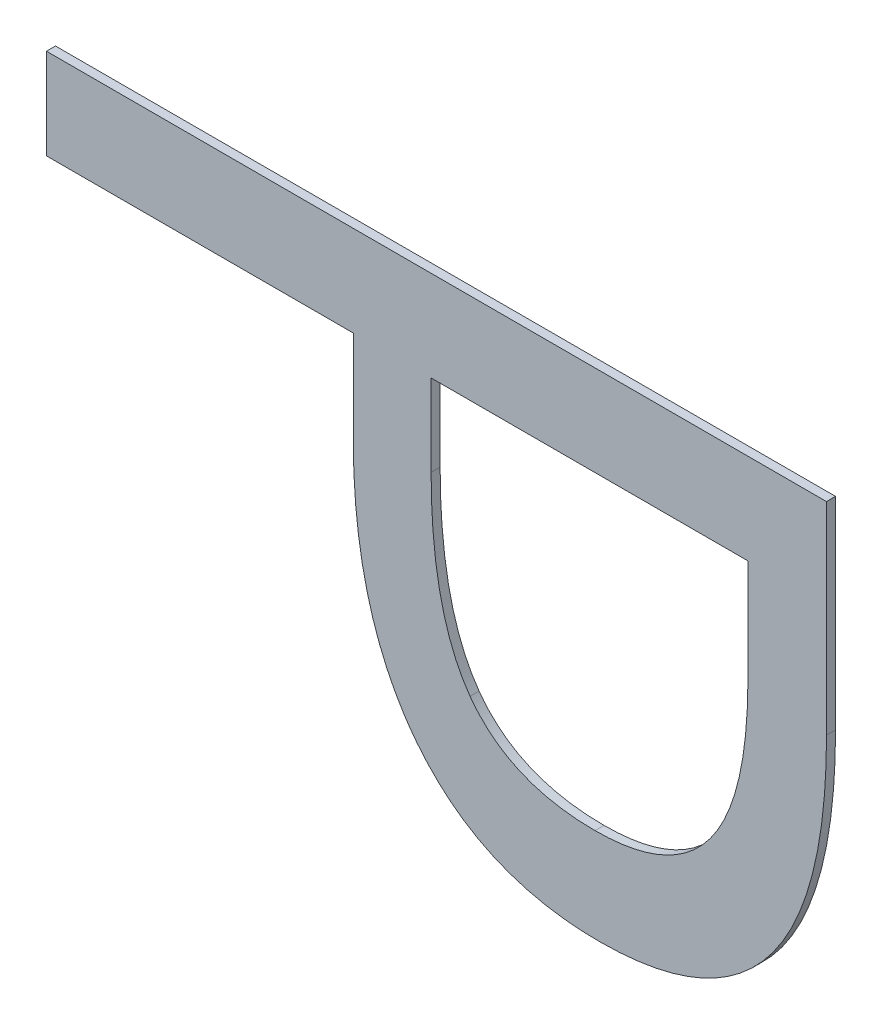
ISO-10303-21;
HEADER;
FILE_DESCRIPTION(('STEP AP214'),'2;1');
FILE_NAME('part.step','',(''),(''),'','','');
FILE_SCHEMA(('AUTOMOTIVE_DESIGN { 1 0 10303 214 1 1 1 1 }'));
ENDSEC;
DATA;
#1=APPLICATION_CONTEXT('core data for automotive mechanical design processes');
#2=APPLICATION_PROTOCOL_DEFINITION('international standard','automotive_design',2000,#1);
#3=PRODUCT_CONTEXT('',#1,'mechanical');
#4=PRODUCT('Part','Part','',(#3));
#5=PRODUCT_RELATED_PRODUCT_CATEGORY('part','',(#4));
#6=PRODUCT_DEFINITION_FORMATION('','',#4);
#7=PRODUCT_DEFINITION_CONTEXT('part definition',#1,'design');
#8=PRODUCT_DEFINITION('design','',#6,#7);
#9=PRODUCT_DEFINITION_SHAPE('','',#8);
#10=(LENGTH_UNIT() NAMED_UNIT(*) SI_UNIT(.MILLI.,.METRE.));
#11=(NAMED_UNIT(*) PLANE_ANGLE_UNIT() SI_UNIT($,.RADIAN.));
#12=(NAMED_UNIT(*) SI_UNIT($,.STERADIAN.) SOLID_ANGLE_UNIT());
#13=UNCERTAINTY_MEASURE_WITH_UNIT(LENGTH_MEASURE(1.E-05),#10,'distance_accuracy_value','');
#14=(GEOMETRIC_REPRESENTATION_CONTEXT(3) GLOBAL_UNCERTAINTY_ASSIGNED_CONTEXT((#13)) GLOBAL_UNIT_ASSIGNED_CONTEXT((#10,
#11,#12)) REPRESENTATION_CONTEXT('',''));
#15=CARTESIAN_POINT('',(0.,0.,0.));
#16=DIRECTION('',(0.,0.,1.));
#17=DIRECTION('',(1.,0.,0.));
#18=AXIS2_PLACEMENT_3D('',#15,#16,#17);
#19=CARTESIAN_POINT('',(32.574920494297,13.734089114766,2.65));
#20=DIRECTION('',(0.,0.,1.));
#21=DIRECTION('',(1.,0.,0.));
#22=AXIS2_PLACEMENT_3D('',#19,#20,#21);
#23=PLANE('',#22);
#24=CARTESIAN_POINT('',(34.216407159745,15.352154523788,2.65));
#25=CARTESIAN_POINT('',(34.121057841601,15.352154523788,2.65));
#26=CARTESIAN_POINT('',(34.07792362625,15.411842440206,2.65));
#27=B_SPLINE_CURVE_WITH_KNOTS('',2,(#24,#25,#26),.UNSPECIFIED.,.F.,.F.,(3,3),(0.,1.),.UNSPECIFIED.);
#28=CARTESIAN_POINT('',(34.216407159745,15.352154523788,2.65));
#29=VERTEX_POINT('',#28);
#30=CARTESIAN_POINT('',(34.07792362625,15.411842440206,2.65));
#31=VERTEX_POINT('',#30);
#32=EDGE_CURVE('E166',#29,#31,#27,.T.);
#33=ORIENTED_EDGE('',*,*,#32,.T.);
#34=CARTESIAN_POINT('',(34.07792362625,15.411842440206,2.65));
#35=CARTESIAN_POINT('',(34.034789410899,15.471530356623,2.65));
#36=CARTESIAN_POINT('',(34.034789410899,15.605095076087,2.65));
#37=B_SPLINE_CURVE_WITH_KNOTS('',2,(#34,#35,#36),.UNSPECIFIED.,.F.,.F.,(3,3),(0.,1.),.UNSPECIFIED.);
#38=CARTESIAN_POINT('',(34.034789410899,15.605095076087,2.65));
#39=VERTEX_POINT('',#38);
#40=EDGE_CURVE('E175',#31,#39,#37,.T.);
#41=ORIENTED_EDGE('',*,*,#40,.T.);
#42=DIRECTION('',(0.,1.,0.));
#43=VECTOR('',#42,1.);
#44=CARTESIAN_POINT('',(34.034789410899,15.650404920721,2.65));
#45=LINE('',#44,#43);
#46=CARTESIAN_POINT('',(34.034789410899,15.695714765355,2.65));
#47=VERTEX_POINT('',#46);
#48=EDGE_CURVE('E184',#39,#47,#45,.T.);
#49=ORIENTED_EDGE('',*,*,#48,.T.);
#50=DIRECTION('',(1.,0.,0.));
#51=VECTOR('',#50,1.);
#52=CARTESIAN_POINT('',(34.210353234784,15.695714765355,2.65));
#53=LINE('',#52,#51);
#54=CARTESIAN_POINT('',(34.385917058668,15.695714765355,2.65));
#55=VERTEX_POINT('',#54);
#56=EDGE_CURVE('E120',#47,#55,#53,.T.);
#57=ORIENTED_EDGE('',*,*,#56,.T.);
#58=DIRECTION('',(0.,1.,0.));
#59=VECTOR('',#58,1.);
#60=CARTESIAN_POINT('',(34.385917058668,15.639526774306,2.65));
#61=LINE('',#60,#59);
#62=CARTESIAN_POINT('',(34.385917058668,15.583338783257,2.65));
#63=VERTEX_POINT('',#62);
#64=EDGE_CURVE('E197',#55,#63,#61,.F.);
#65=ORIENTED_EDGE('',*,*,#64,.T.);
#66=CARTESIAN_POINT('',(34.385917058668,15.583338783257,2.65));
#67=CARTESIAN_POINT('',(34.385917058668,15.464530505886,2.65));
#68=CARTESIAN_POINT('',(34.344012546825,15.408342514837,2.65));
#69=B_SPLINE_CURVE_WITH_KNOTS('',2,(#66,#67,#68),.UNSPECIFIED.,.F.,.F.,(3,3),(0.,1.),.UNSPECIFIED.);
#70=CARTESIAN_POINT('',(34.344012546825,15.408342514837,2.65));
#71=VERTEX_POINT('',#70);
#72=EDGE_CURVE('E147',#63,#71,#69,.T.);
#73=ORIENTED_EDGE('',*,*,#72,.T.);
#74=CARTESIAN_POINT('',(34.344012546825,15.408342514837,2.65));
#75=CARTESIAN_POINT('',(34.302108034982,15.352154523788,2.65));
#76=CARTESIAN_POINT('',(34.216407159745,15.352154523788,2.65));
#77=B_SPLINE_CURVE_WITH_KNOTS('',2,(#74,#75,#76),.UNSPECIFIED.,.F.,.F.,(3,3),(0.,1.),.UNSPECIFIED.);
#78=EDGE_CURVE('E157',#71,#29,#77,.T.);
#79=ORIENTED_EDGE('',*,*,#78,.T.);
#80=EDGE_LOOP('',(#33,#41,#49,#57,#65,#73,#79));
#81=FACE_BOUND('',#80,.T.);
#82=DIRECTION('',(0.,1.,0.));
#83=VECTOR('',#82,1.);
#84=CARTESIAN_POINT('',(33.948520980198,15.644823958647,2.65));
#85=LINE('',#84,#83);
#86=CARTESIAN_POINT('',(33.948520980198,15.695714765355,2.65));
#87=VERTEX_POINT('',#86);
#88=CARTESIAN_POINT('',(33.948520980198,15.593933151939,2.65));
#89=VERTEX_POINT('',#88);
#90=EDGE_CURVE('E201',#87,#89,#85,.F.);
#91=ORIENTED_EDGE('',*,*,#90,.T.);
#92=CARTESIAN_POINT('',(33.948520980198,15.593933151939,2.65));
#93=CARTESIAN_POINT('',(33.948520980198,15.427261030342,2.65));
#94=CARTESIAN_POINT('',(34.019181635608,15.337681859427,2.65));
#95=B_SPLINE_CURVE_WITH_KNOTS('',2,(#92,#93,#94),.UNSPECIFIED.,.F.,.F.,(3,3),(0.,1.),.UNSPECIFIED.);
#96=CARTESIAN_POINT('',(34.019181635608,15.337681859427,2.65));
#97=VERTEX_POINT('',#96);
#98=EDGE_CURVE('E117',#89,#97,#95,.T.);
#99=ORIENTED_EDGE('',*,*,#98,.T.);
#100=CARTESIAN_POINT('',(34.019181635608,15.337681859427,2.65));
#101=CARTESIAN_POINT('',(34.089842291018,15.248102688512,2.65));
#102=CARTESIAN_POINT('',(34.221136788622,15.248102688512,2.65));
#103=B_SPLINE_CURVE_WITH_KNOTS('',2,(#100,#101,#102),.UNSPECIFIED.,.F.,.F.,(3,3),(0.,1.),.UNSPECIFIED.);
#104=CARTESIAN_POINT('',(34.221136788622,15.248102688512,2.65));
#105=VERTEX_POINT('',#104);
#106=EDGE_CURVE('E112',#97,#105,#103,.T.);
#107=ORIENTED_EDGE('',*,*,#106,.T.);
#108=CARTESIAN_POINT('',(34.221136788622,15.248102688512,2.65));
#109=CARTESIAN_POINT('',(34.47294222999,15.248102688512,2.65));
#110=CARTESIAN_POINT('',(34.47294222999,15.571987673954,2.65));
#111=B_SPLINE_CURVE_WITH_KNOTS('',2,(#108,#109,#110),.UNSPECIFIED.,.F.,.F.,(3,3),(0.,1.),.UNSPECIFIED.);
#112=CARTESIAN_POINT('',(34.47294222999,15.571987673954,2.65));
#113=VERTEX_POINT('',#112);
#114=EDGE_CURVE('E97',#105,#113,#111,.T.);
#115=ORIENTED_EDGE('',*,*,#114,.T.);
#116=DIRECTION('',(0.,1.,0.));
#117=VECTOR('',#116,1.);
#118=CARTESIAN_POINT('',(34.47294222999,15.68407987832,2.65));
#119=LINE('',#118,#117);
#120=CARTESIAN_POINT('',(34.47294222999,15.796172082685,2.65));
#121=VERTEX_POINT('',#120);
#122=EDGE_CURVE('E223',#113,#121,#119,.T.);
#123=ORIENTED_EDGE('',*,*,#122,.T.);
#124=DIRECTION('',(1.,0.,0.));
#125=VECTOR('',#124,1.);
#126=CARTESIAN_POINT('',(34.040748743283,15.796172082685,2.65));
#127=LINE('',#126,#125);
#128=CARTESIAN_POINT('',(33.608555256577,15.796172082685,2.65));
#129=VERTEX_POINT('',#128);
#130=EDGE_CURVE('E218',#121,#129,#127,.F.);
#131=ORIENTED_EDGE('',*,*,#130,.T.);
#132=DIRECTION('',(0.,1.,0.));
#133=VECTOR('',#132,1.);
#134=CARTESIAN_POINT('',(33.608555256577,15.74594342402,2.65));
#135=LINE('',#134,#133);
#136=CARTESIAN_POINT('',(33.608555256577,15.695714765355,2.65));
#137=VERTEX_POINT('',#136);
#138=EDGE_CURVE('E212',#129,#137,#135,.F.);
#139=ORIENTED_EDGE('',*,*,#138,.T.);
#140=DIRECTION('',(1.,0.,0.));
#141=VECTOR('',#140,1.);
#142=CARTESIAN_POINT('',(33.778538118387,15.695714765355,2.65));
#143=LINE('',#142,#141);
#144=EDGE_CURVE('E206',#137,#87,#143,.T.);
#145=ORIENTED_EDGE('',*,*,#144,.T.);
#146=EDGE_LOOP('',(#91,#99,#107,#115,#123,#131,#139,#145));
#147=FACE_BOUND('',#146,.T.);
#148=ADVANCED_FACE('F17',(#81,#147),#23,.T.);
#149=CARTESIAN_POINT('',(34.47294222999,15.571987673954,2.64));
#150=CARTESIAN_POINT('',(34.47294222999,15.248102688512,2.64));
#151=CARTESIAN_POINT('',(34.221136788622,15.248102688512,2.64));
#152=(BOUNDED_CURVE() B_SPLINE_CURVE(2,(#149,#150,#151),.UNSPECIFIED.,.F.,
.F.) B_SPLINE_CURVE_WITH_KNOTS((3,3),(0.,1.),
.UNSPECIFIED.) CURVE() GEOMETRIC_REPRESENTATION_ITEM() RATIONAL_B_SPLINE_CURVE((1.,1.,1.)) REPRESENTATION_ITEM(''));
#153=DIRECTION('',(0.,0.,1.));
#154=VECTOR('',#153,1.);
#155=SURFACE_OF_LINEAR_EXTRUSION('',#152,#154);
#156=DIRECTION('',(0.,0.,1.));
#157=VECTOR('',#156,1.);
#158=CARTESIAN_POINT('',(34.221136788622,15.248102688512,2.64));
#159=LINE('',#158,#157);
#160=CARTESIAN_POINT('',(34.221136788622,15.248102688512,2.64));
#161=VERTEX_POINT('',#160);
#162=EDGE_CURVE('E101',#105,#161,#159,.F.);
#163=ORIENTED_EDGE('',*,*,#162,.T.);
#164=CARTESIAN_POINT('',(34.221136788622,15.248102688512,2.64));
#165=CARTESIAN_POINT('',(34.47294222999,15.248102688512,2.64));
#166=CARTESIAN_POINT('',(34.47294222999,15.571987673954,2.64));
#167=B_SPLINE_CURVE_WITH_KNOTS('',2,(#164,#165,#166),.UNSPECIFIED.,.F.,.F.,(3,3),(0.,1.),.UNSPECIFIED.);
#168=CARTESIAN_POINT('',(34.47294222999,15.571987673954,2.64));
#169=VERTEX_POINT('',#168);
#170=EDGE_CURVE('E192',#161,#169,#167,.T.);
#171=ORIENTED_EDGE('',*,*,#170,.T.);
#172=DIRECTION('',(0.,0.,1.));
#173=VECTOR('',#172,1.);
#174=CARTESIAN_POINT('',(34.47294222999,15.571987673954,2.64));
#175=LINE('',#174,#173);
#176=EDGE_CURVE('E103',#169,#113,#175,.T.);
#177=ORIENTED_EDGE('',*,*,#176,.T.);
#178=ORIENTED_EDGE('',*,*,#114,.F.);
#179=EDGE_LOOP('',(#163,#171,#177,#178));
#180=FACE_BOUND('',#179,.T.);
#181=ADVANCED_FACE('F99',(#180),#155,.F.);
#182=CARTESIAN_POINT('',(34.47294222999,15.68407987832,2.64));
#183=DIRECTION('',(-1.,0.,0.));
#184=DIRECTION('',(0.,0.,1.));
#185=AXIS2_PLACEMENT_3D('',#182,#183,#184);
#186=PLANE('',#185);
#187=ORIENTED_EDGE('',*,*,#176,.F.);
#188=DIRECTION('',(0.,1.,0.));
#189=VECTOR('',#188,1.);
#190=CARTESIAN_POINT('',(34.47294222999,13.734089114766,2.64));
#191=LINE('',#190,#189);
#192=CARTESIAN_POINT('',(34.47294222999,15.796172082685,2.64));
#193=VERTEX_POINT('',#192);
#194=EDGE_CURVE('E236',#169,#193,#191,.T.);
#195=ORIENTED_EDGE('',*,*,#194,.T.);
#196=DIRECTION('',(0.,0.,-1.));
#197=VECTOR('',#196,1.);
#198=CARTESIAN_POINT('',(34.47294222999,15.796172082685,2.64));
#199=LINE('',#198,#197);
#200=EDGE_CURVE('E221',#193,#121,#199,.F.);
#201=ORIENTED_EDGE('',*,*,#200,.T.);
#202=ORIENTED_EDGE('',*,*,#122,.F.);
#203=EDGE_LOOP('',(#187,#195,#201,#202));
#204=FACE_BOUND('',#203,.T.);
#205=ADVANCED_FACE('F290',(#204),#186,.F.);
#206=CARTESIAN_POINT('',(34.040748743283,15.796172082685,2.64));
#207=DIRECTION('',(0.,-1.,0.));
#208=DIRECTION('',(0.,0.,-1.));
#209=AXIS2_PLACEMENT_3D('',#206,#207,#208);
#210=PLANE('',#209);
#211=ORIENTED_EDGE('',*,*,#200,.F.);
#212=DIRECTION('',(1.,0.,0.));
#213=VECTOR('',#212,1.);
#214=CARTESIAN_POINT('',(32.574920494297,15.796172082685,2.64));
#215=LINE('',#214,#213);
#216=CARTESIAN_POINT('',(33.608555256577,15.796172082685,2.64));
#217=VERTEX_POINT('',#216);
#218=EDGE_CURVE('E232',#193,#217,#215,.F.);
#219=ORIENTED_EDGE('',*,*,#218,.T.);
#220=DIRECTION('',(0.,0.,-1.));
#221=VECTOR('',#220,1.);
#222=CARTESIAN_POINT('',(33.608555256577,15.796172082685,2.64));
#223=LINE('',#222,#221);
#224=EDGE_CURVE('E215',#217,#129,#223,.F.);
#225=ORIENTED_EDGE('',*,*,#224,.T.);
#226=ORIENTED_EDGE('',*,*,#130,.F.);
#227=EDGE_LOOP('',(#211,#219,#225,#226));
#228=FACE_BOUND('',#227,.T.);
#229=ADVANCED_FACE('F286',(#228),#210,.F.);
#230=CARTESIAN_POINT('',(33.608555256577,15.74594342402,2.64));
#231=DIRECTION('',(1.,0.,0.));
#232=DIRECTION('',(0.,0.,-1.));
#233=AXIS2_PLACEMENT_3D('',#230,#231,#232);
#234=PLANE('',#233);
#235=ORIENTED_EDGE('',*,*,#224,.F.);
#236=DIRECTION('',(0.,1.,0.));
#237=VECTOR('',#236,1.);
#238=CARTESIAN_POINT('',(33.608555256577,13.734089114766,2.64));
#239=LINE('',#238,#237);
#240=CARTESIAN_POINT('',(33.608555256577,15.695714765355,2.64));
#241=VERTEX_POINT('',#240);
#242=EDGE_CURVE('E235',#217,#241,#239,.F.);
#243=ORIENTED_EDGE('',*,*,#242,.T.);
#244=DIRECTION('',(0.,0.,1.));
#245=VECTOR('',#244,1.);
#246=CARTESIAN_POINT('',(33.608555256577,15.695714765355,2.64));
#247=LINE('',#246,#245);
#248=EDGE_CURVE('E209',#241,#137,#247,.T.);
#249=ORIENTED_EDGE('',*,*,#248,.T.);
#250=ORIENTED_EDGE('',*,*,#138,.F.);
#251=EDGE_LOOP('',(#235,#243,#249,#250));
#252=FACE_BOUND('',#251,.T.);
#253=ADVANCED_FACE('F282',(#252),#234,.F.);
#254=CARTESIAN_POINT('',(33.778538118387,15.695714765355,2.64));
#255=DIRECTION('',(0.,1.,0.));
#256=DIRECTION('',(0.,0.,1.));
#257=AXIS2_PLACEMENT_3D('',#254,#255,#256);
#258=PLANE('',#257);
#259=ORIENTED_EDGE('',*,*,#248,.F.);
#260=DIRECTION('',(1.,0.,0.));
#261=VECTOR('',#260,1.);
#262=CARTESIAN_POINT('',(32.574920494297,15.695714765355,2.64));
#263=LINE('',#262,#261);
#264=CARTESIAN_POINT('',(33.948520980198,15.695714765355,2.64));
#265=VERTEX_POINT('',#264);
#266=EDGE_CURVE('E245',#241,#265,#263,.T.);
#267=ORIENTED_EDGE('',*,*,#266,.T.);
#268=DIRECTION('',(0.,0.,-1.));
#269=VECTOR('',#268,1.);
#270=CARTESIAN_POINT('',(33.948520980198,15.695714765355,2.64));
#271=LINE('',#270,#269);
#272=EDGE_CURVE('E203',#265,#87,#271,.F.);
#273=ORIENTED_EDGE('',*,*,#272,.T.);
#274=ORIENTED_EDGE('',*,*,#144,.F.);
#275=EDGE_LOOP('',(#259,#267,#273,#274));
#276=FACE_BOUND('',#275,.T.);
#277=ADVANCED_FACE('F278',(#276),#258,.F.);
#278=CARTESIAN_POINT('',(33.948520980198,15.644823958647,2.64));
#279=DIRECTION('',(1.,0.,0.));
#280=DIRECTION('',(0.,0.,-1.));
#281=AXIS2_PLACEMENT_3D('',#278,#279,#280);
#282=PLANE('',#281);
#283=ORIENTED_EDGE('',*,*,#272,.F.);
#284=DIRECTION('',(0.,1.,0.));
#285=VECTOR('',#284,1.);
#286=CARTESIAN_POINT('',(33.948520980198,13.734089114766,2.64));
#287=LINE('',#286,#285);
#288=CARTESIAN_POINT('',(33.948520980198,15.593933151939,2.64));
#289=VERTEX_POINT('',#288);
#290=EDGE_CURVE('E254',#265,#289,#287,.F.);
#291=ORIENTED_EDGE('',*,*,#290,.T.);
#292=DIRECTION('',(0.,0.,1.));
#293=VECTOR('',#292,1.);
#294=CARTESIAN_POINT('',(33.948520980198,15.593933151939,2.64));
#295=LINE('',#294,#293);
#296=EDGE_CURVE('E146',#289,#89,#295,.T.);
#297=ORIENTED_EDGE('',*,*,#296,.T.);
#298=ORIENTED_EDGE('',*,*,#90,.F.);
#299=EDGE_LOOP('',(#283,#291,#297,#298));
#300=FACE_BOUND('',#299,.T.);
#301=ADVANCED_FACE('F272',(#300),#282,.F.);
#302=CARTESIAN_POINT('',(34.019181635608,15.337681859427,2.64));
#303=CARTESIAN_POINT('',(33.948520980198,15.427261030342,2.64));
#304=CARTESIAN_POINT('',(33.948520980198,15.593933151939,2.64));
#305=(BOUNDED_CURVE() B_SPLINE_CURVE(2,(#302,#303,#304),.UNSPECIFIED.,.F.,
.F.) B_SPLINE_CURVE_WITH_KNOTS((3,3),(0.,1.),
.UNSPECIFIED.) CURVE() GEOMETRIC_REPRESENTATION_ITEM() RATIONAL_B_SPLINE_CURVE((1.,1.,1.)) REPRESENTATION_ITEM(''));
#306=DIRECTION('',(0.,0.,1.));
#307=VECTOR('',#306,1.);
#308=SURFACE_OF_LINEAR_EXTRUSION('',#305,#307);
#309=ORIENTED_EDGE('',*,*,#296,.F.);
#310=CARTESIAN_POINT('',(33.948520980198,15.593933151939,2.64));
#311=CARTESIAN_POINT('',(33.948520980198,15.427261030342,2.64));
#312=CARTESIAN_POINT('',(34.019181635608,15.337681859427,2.64));
#313=B_SPLINE_CURVE_WITH_KNOTS('',2,(#310,#311,#312),.UNSPECIFIED.,.F.,.F.,(3,3),(0.,1.),.UNSPECIFIED.);
#314=CARTESIAN_POINT('',(34.019181635608,15.337681859427,2.64));
#315=VERTEX_POINT('',#314);
#316=EDGE_CURVE('E322',#289,#315,#313,.T.);
#317=ORIENTED_EDGE('',*,*,#316,.T.);
#318=DIRECTION('',(0.,0.,1.));
#319=VECTOR('',#318,1.);
#320=CARTESIAN_POINT('',(34.019181635608,15.337681859427,2.64));
#321=LINE('',#320,#319);
#322=EDGE_CURVE('E116',#315,#97,#321,.T.);
#323=ORIENTED_EDGE('',*,*,#322,.T.);
#324=ORIENTED_EDGE('',*,*,#98,.F.);
#325=EDGE_LOOP('',(#309,#317,#323,#324));
#326=FACE_BOUND('',#325,.T.);
#327=ADVANCED_FACE('F268',(#326),#308,.F.);
#328=CARTESIAN_POINT('',(34.221136788622,15.248102688512,2.64));
#329=CARTESIAN_POINT('',(34.089842291018,15.248102688512,2.64));
#330=CARTESIAN_POINT('',(34.019181635608,15.337681859427,2.64));
#331=(BOUNDED_CURVE() B_SPLINE_CURVE(2,(#328,#329,#330),.UNSPECIFIED.,.F.,
.F.) B_SPLINE_CURVE_WITH_KNOTS((3,3),(0.,1.),
.UNSPECIFIED.) CURVE() GEOMETRIC_REPRESENTATION_ITEM() RATIONAL_B_SPLINE_CURVE((1.,1.,1.)) REPRESENTATION_ITEM(''));
#332=DIRECTION('',(0.,0.,1.));
#333=VECTOR('',#332,1.);
#334=SURFACE_OF_LINEAR_EXTRUSION('',#331,#333);
#335=ORIENTED_EDGE('',*,*,#322,.F.);
#336=CARTESIAN_POINT('',(34.019181635608,15.337681859427,2.64));
#337=CARTESIAN_POINT('',(34.089842291018,15.248102688512,2.64));
#338=CARTESIAN_POINT('',(34.221136788622,15.248102688512,2.64));
#339=B_SPLINE_CURVE_WITH_KNOTS('',2,(#336,#337,#338),.UNSPECIFIED.,.F.,.F.,(3,3),(0.,1.),.UNSPECIFIED.);
#340=EDGE_CURVE('E115',#315,#161,#339,.T.);
#341=ORIENTED_EDGE('',*,*,#340,.T.);
#342=ORIENTED_EDGE('',*,*,#162,.F.);
#343=ORIENTED_EDGE('',*,*,#106,.F.);
#344=EDGE_LOOP('',(#335,#341,#342,#343));
#345=FACE_BOUND('',#344,.T.);
#346=ADVANCED_FACE('F111',(#345),#334,.F.);
#347=CARTESIAN_POINT('',(34.210353234784,15.695714765355,2.64));
#348=DIRECTION('',(0.,1.,0.));
#349=DIRECTION('',(0.,0.,1.));
#350=AXIS2_PLACEMENT_3D('',#347,#348,#349);
#351=PLANE('',#350);
#352=DIRECTION('',(0.,0.,1.));
#353=VECTOR('',#352,1.);
#354=CARTESIAN_POINT('',(34.034789410899,15.695714765355,2.64));
#355=LINE('',#354,#353);
#356=CARTESIAN_POINT('',(34.034789410899,15.695714765355,2.64));
#357=VERTEX_POINT('',#356);
#358=EDGE_CURVE('E183',#47,#357,#355,.F.);
#359=ORIENTED_EDGE('',*,*,#358,.T.);
#360=DIRECTION('',(1.,0.,0.));
#361=VECTOR('',#360,1.);
#362=CARTESIAN_POINT('',(32.574920494297,15.695714765355,2.64));
#363=LINE('',#362,#361);
#364=CARTESIAN_POINT('',(34.385917058668,15.695714765355,2.64));
#365=VERTEX_POINT('',#364);
#366=EDGE_CURVE('E356',#357,#365,#363,.T.);
#367=ORIENTED_EDGE('',*,*,#366,.T.);
#368=DIRECTION('',(0.,0.,-1.));
#369=VECTOR('',#368,1.);
#370=CARTESIAN_POINT('',(34.385917058668,15.695714765355,2.64));
#371=LINE('',#370,#369);
#372=EDGE_CURVE('E123',#365,#55,#371,.F.);
#373=ORIENTED_EDGE('',*,*,#372,.T.);
#374=ORIENTED_EDGE('',*,*,#56,.F.);
#375=EDGE_LOOP('',(#359,#367,#373,#374));
#376=FACE_BOUND('',#375,.T.);
#377=ADVANCED_FACE('F425',(#376),#351,.F.);
#378=CARTESIAN_POINT('',(34.385917058668,15.639526774306,2.64));
#379=DIRECTION('',(1.,0.,0.));
#380=DIRECTION('',(0.,0.,-1.));
#381=AXIS2_PLACEMENT_3D('',#378,#379,#380);
#382=PLANE('',#381);
#383=ORIENTED_EDGE('',*,*,#372,.F.);
#384=DIRECTION('',(0.,1.,0.));
#385=VECTOR('',#384,1.);
#386=CARTESIAN_POINT('',(34.385917058668,13.734089114766,2.64));
#387=LINE('',#386,#385);
#388=CARTESIAN_POINT('',(34.385917058668,15.583338783257,2.64));
#389=VERTEX_POINT('',#388);
#390=EDGE_CURVE('E353',#365,#389,#387,.F.);
#391=ORIENTED_EDGE('',*,*,#390,.T.);
#392=DIRECTION('',(0.,0.,1.));
#393=VECTOR('',#392,1.);
#394=CARTESIAN_POINT('',(34.385917058668,15.583338783257,2.64));
#395=LINE('',#394,#393);
#396=EDGE_CURVE('E156',#389,#63,#395,.T.);
#397=ORIENTED_EDGE('',*,*,#396,.T.);
#398=ORIENTED_EDGE('',*,*,#64,.F.);
#399=EDGE_LOOP('',(#383,#391,#397,#398));
#400=FACE_BOUND('',#399,.T.);
#401=ADVANCED_FACE('F422',(#400),#382,.F.);
#402=CARTESIAN_POINT('',(34.344012546825,15.408342514837,2.64));
#403=CARTESIAN_POINT('',(34.385917058668,15.464530505886,2.64));
#404=CARTESIAN_POINT('',(34.385917058668,15.583338783257,2.64));
#405=(BOUNDED_CURVE() B_SPLINE_CURVE(2,(#402,#403,#404),.UNSPECIFIED.,.F.,
.F.) B_SPLINE_CURVE_WITH_KNOTS((3,3),(0.,1.),
.UNSPECIFIED.) CURVE() GEOMETRIC_REPRESENTATION_ITEM() RATIONAL_B_SPLINE_CURVE((1.,1.,1.)) REPRESENTATION_ITEM(''));
#406=DIRECTION('',(0.,0.,1.));
#407=VECTOR('',#406,1.);
#408=SURFACE_OF_LINEAR_EXTRUSION('',#405,#407);
#409=ORIENTED_EDGE('',*,*,#396,.F.);
#410=CARTESIAN_POINT('',(34.385917058668,15.583338783257,2.64));
#411=CARTESIAN_POINT('',(34.385917058668,15.464530505886,2.64));
#412=CARTESIAN_POINT('',(34.344012546825,15.408342514837,2.64));
#413=B_SPLINE_CURVE_WITH_KNOTS('',2,(#410,#411,#412),.UNSPECIFIED.,.F.,.F.,(3,3),(0.,1.),.UNSPECIFIED.);
#414=CARTESIAN_POINT('',(34.344012546825,15.408342514837,2.64));
#415=VERTEX_POINT('',#414);
#416=EDGE_CURVE('E329',#389,#415,#413,.T.);
#417=ORIENTED_EDGE('',*,*,#416,.T.);
#418=DIRECTION('',(0.,0.,1.));
#419=VECTOR('',#418,1.);
#420=CARTESIAN_POINT('',(34.344012546825,15.408342514837,2.64));
#421=LINE('',#420,#419);
#422=EDGE_CURVE('E155',#415,#71,#421,.T.);
#423=ORIENTED_EDGE('',*,*,#422,.T.);
#424=ORIENTED_EDGE('',*,*,#72,.F.);
#425=EDGE_LOOP('',(#409,#417,#423,#424));
#426=FACE_BOUND('',#425,.T.);
#427=ADVANCED_FACE('F419',(#426),#408,.F.);
#428=CARTESIAN_POINT('',(34.216407159745,15.352154523788,2.64));
#429=CARTESIAN_POINT('',(34.302108034982,15.352154523788,2.64));
#430=CARTESIAN_POINT('',(34.344012546825,15.408342514837,2.64));
#431=(BOUNDED_CURVE() B_SPLINE_CURVE(2,(#428,#429,#430),.UNSPECIFIED.,.F.,
.F.) B_SPLINE_CURVE_WITH_KNOTS((3,3),(0.,1.),
.UNSPECIFIED.) CURVE() GEOMETRIC_REPRESENTATION_ITEM() RATIONAL_B_SPLINE_CURVE((1.,1.,1.)) REPRESENTATION_ITEM(''));
#432=DIRECTION('',(0.,0.,1.));
#433=VECTOR('',#432,1.);
#434=SURFACE_OF_LINEAR_EXTRUSION('',#431,#433);
#435=ORIENTED_EDGE('',*,*,#422,.F.);
#436=CARTESIAN_POINT('',(34.344012546825,15.408342514837,2.64));
#437=CARTESIAN_POINT('',(34.302108034982,15.352154523788,2.64));
#438=CARTESIAN_POINT('',(34.216407159745,15.352154523788,2.64));
#439=B_SPLINE_CURVE_WITH_KNOTS('',2,(#436,#437,#438),.UNSPECIFIED.,.F.,.F.,(3,3),(0.,1.),.UNSPECIFIED.);
#440=CARTESIAN_POINT('',(34.216407159745,15.352154523788,2.64));
#441=VERTEX_POINT('',#440);
#442=EDGE_CURVE('E332',#415,#441,#439,.T.);
#443=ORIENTED_EDGE('',*,*,#442,.T.);
#444=DIRECTION('',(0.,0.,1.));
#445=VECTOR('',#444,1.);
#446=CARTESIAN_POINT('',(34.216407159745,15.352154523788,2.64));
#447=LINE('',#446,#445);
#448=EDGE_CURVE('E165',#441,#29,#447,.T.);
#449=ORIENTED_EDGE('',*,*,#448,.T.);
#450=ORIENTED_EDGE('',*,*,#78,.F.);
#451=EDGE_LOOP('',(#435,#443,#449,#450));
#452=FACE_BOUND('',#451,.T.);
#453=ADVANCED_FACE('F390',(#452),#434,.F.);
#454=CARTESIAN_POINT('',(34.07792362625,15.411842440206,2.64));
#455=CARTESIAN_POINT('',(34.121057841601,15.352154523788,2.64));
#456=CARTESIAN_POINT('',(34.216407159745,15.352154523788,2.64));
#457=(BOUNDED_CURVE() B_SPLINE_CURVE(2,(#454,#455,#456),.UNSPECIFIED.,.F.,
.F.) B_SPLINE_CURVE_WITH_KNOTS((3,3),(0.,1.),
.UNSPECIFIED.) CURVE() GEOMETRIC_REPRESENTATION_ITEM() RATIONAL_B_SPLINE_CURVE((1.,1.,1.)) REPRESENTATION_ITEM(''));
#458=DIRECTION('',(0.,0.,1.));
#459=VECTOR('',#458,1.);
#460=SURFACE_OF_LINEAR_EXTRUSION('',#457,#459);
#461=ORIENTED_EDGE('',*,*,#448,.F.);
#462=CARTESIAN_POINT('',(34.216407159745,15.352154523788,2.64));
#463=CARTESIAN_POINT('',(34.121057841601,15.352154523788,2.64));
#464=CARTESIAN_POINT('',(34.07792362625,15.411842440206,2.64));
#465=B_SPLINE_CURVE_WITH_KNOTS('',2,(#462,#463,#464),.UNSPECIFIED.,.F.,.F.,(3,3),(0.,1.),.UNSPECIFIED.);
#466=CARTESIAN_POINT('',(34.07792362625,15.411842440206,2.64));
#467=VERTEX_POINT('',#466);
#468=EDGE_CURVE('E335',#441,#467,#465,.T.);
#469=ORIENTED_EDGE('',*,*,#468,.T.);
#470=DIRECTION('',(0.,0.,1.));
#471=VECTOR('',#470,1.);
#472=CARTESIAN_POINT('',(34.07792362625,15.411842440206,2.64));
#473=LINE('',#472,#471);
#474=EDGE_CURVE('E174',#467,#31,#473,.T.);
#475=ORIENTED_EDGE('',*,*,#474,.T.);
#476=ORIENTED_EDGE('',*,*,#32,.F.);
#477=EDGE_LOOP('',(#461,#469,#475,#476));
#478=FACE_BOUND('',#477,.T.);
#479=ADVANCED_FACE('F386',(#478),#460,.F.);
#480=CARTESIAN_POINT('',(34.034789410899,15.605095076087,2.64));
#481=CARTESIAN_POINT('',(34.034789410899,15.471530356623,2.64));
#482=CARTESIAN_POINT('',(34.07792362625,15.411842440206,2.64));
#483=(BOUNDED_CURVE() B_SPLINE_CURVE(2,(#480,#481,#482),.UNSPECIFIED.,.F.,
.F.) B_SPLINE_CURVE_WITH_KNOTS((3,3),(0.,1.),
.UNSPECIFIED.) CURVE() GEOMETRIC_REPRESENTATION_ITEM() RATIONAL_B_SPLINE_CURVE((1.,1.,1.)) REPRESENTATION_ITEM(''));
#484=DIRECTION('',(0.,0.,1.));
#485=VECTOR('',#484,1.);
#486=SURFACE_OF_LINEAR_EXTRUSION('',#483,#485);
#487=ORIENTED_EDGE('',*,*,#474,.F.);
#488=CARTESIAN_POINT('',(34.07792362625,15.411842440206,2.64));
#489=CARTESIAN_POINT('',(34.034789410899,15.471530356623,2.64));
#490=CARTESIAN_POINT('',(34.034789410899,15.605095076087,2.64));
#491=B_SPLINE_CURVE_WITH_KNOTS('',2,(#488,#489,#490),.UNSPECIFIED.,.F.,.F.,(3,3),(0.,1.),.UNSPECIFIED.);
#492=CARTESIAN_POINT('',(34.034789410899,15.605095076087,2.64));
#493=VERTEX_POINT('',#492);
#494=EDGE_CURVE('E27',#467,#493,#491,.T.);
#495=ORIENTED_EDGE('',*,*,#494,.T.);
#496=DIRECTION('',(0.,0.,1.));
#497=VECTOR('',#496,1.);
#498=CARTESIAN_POINT('',(34.034789410899,15.605095076087,2.64));
#499=LINE('',#498,#497);
#500=EDGE_CURVE('E35',#493,#39,#499,.T.);
#501=ORIENTED_EDGE('',*,*,#500,.T.);
#502=ORIENTED_EDGE('',*,*,#40,.F.);
#503=EDGE_LOOP('',(#487,#495,#501,#502));
#504=FACE_BOUND('',#503,.T.);
#505=ADVANCED_FACE('F308',(#504),#486,.F.);
#506=CARTESIAN_POINT('',(34.034789410899,15.650404920721,2.64));
#507=DIRECTION('',(-1.,0.,0.));
#508=DIRECTION('',(0.,0.,1.));
#509=AXIS2_PLACEMENT_3D('',#506,#507,#508);
#510=PLANE('',#509);
#511=ORIENTED_EDGE('',*,*,#500,.F.);
#512=DIRECTION('',(0.,1.,0.));
#513=VECTOR('',#512,1.);
#514=CARTESIAN_POINT('',(34.034789410899,13.734089114766,2.64));
#515=LINE('',#514,#513);
#516=EDGE_CURVE('E11',#493,#357,#515,.T.);
#517=ORIENTED_EDGE('',*,*,#516,.T.);
#518=ORIENTED_EDGE('',*,*,#358,.F.);
#519=ORIENTED_EDGE('',*,*,#48,.F.);
#520=EDGE_LOOP('',(#511,#517,#518,#519));
#521=FACE_BOUND('',#520,.T.);
#522=ADVANCED_FACE('F302',(#521),#510,.F.);
#523=CARTESIAN_POINT('',(32.574920494297,13.734089114766,2.64));
#524=DIRECTION('',(0.,0.,1.));
#525=DIRECTION('',(1.,0.,0.));
#526=AXIS2_PLACEMENT_3D('',#523,#524,#525);
#527=PLANE('',#526);
#528=ORIENTED_EDGE('',*,*,#494,.F.);
#529=ORIENTED_EDGE('',*,*,#468,.F.);
#530=ORIENTED_EDGE('',*,*,#442,.F.);
#531=ORIENTED_EDGE('',*,*,#416,.F.);
#532=ORIENTED_EDGE('',*,*,#390,.F.);
#533=ORIENTED_EDGE('',*,*,#366,.F.);
#534=ORIENTED_EDGE('',*,*,#516,.F.);
#535=EDGE_LOOP('',(#528,#529,#530,#531,#532,#533,#534));
#536=FACE_BOUND('',#535,.T.);
#537=ORIENTED_EDGE('',*,*,#316,.F.);
#538=ORIENTED_EDGE('',*,*,#290,.F.);
#539=ORIENTED_EDGE('',*,*,#266,.F.);
#540=ORIENTED_EDGE('',*,*,#242,.F.);
#541=ORIENTED_EDGE('',*,*,#218,.F.);
#542=ORIENTED_EDGE('',*,*,#194,.F.);
#543=ORIENTED_EDGE('',*,*,#170,.F.);
#544=ORIENTED_EDGE('',*,*,#340,.F.);
#545=EDGE_LOOP('',(#537,#538,#539,#540,#541,#542,#543,#544));
#546=FACE_BOUND('',#545,.T.);
#547=ADVANCED_FACE('F300',(#536,#546),#527,.F.);
#548=CLOSED_SHELL('',(#148,#181,#205,#229,#253,#277,#301,#327,#346,#377,#401,#427,#453,#479,
#505,#522,#547));
#549=MANIFOLD_SOLID_BREP('B1',#548);
#550=ADVANCED_BREP_SHAPE_REPRESENTATION('',(#18,#549),#14);
#551=SHAPE_DEFINITION_REPRESENTATION(#9,#550);
ENDSEC;
END-ISO-10303-21;
